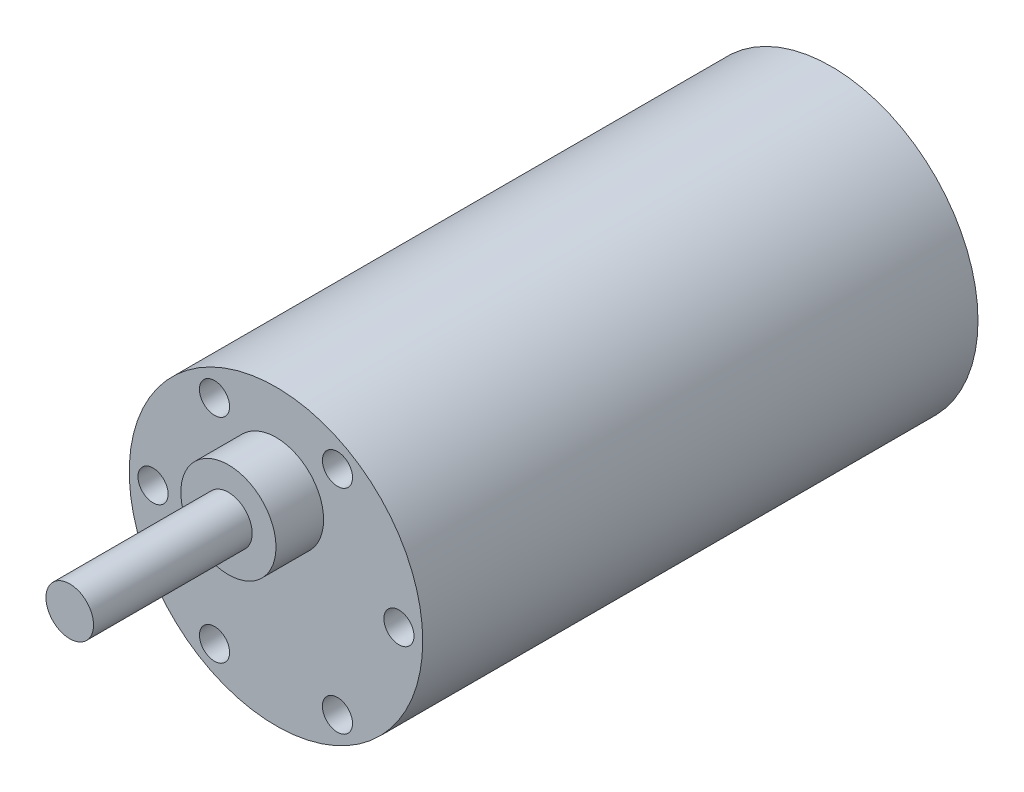
ISO-10303-21;
HEADER;
FILE_DESCRIPTION(('STEP AP214'),'2;1');
FILE_NAME('part.step','',(''),(''),'','','');
FILE_SCHEMA(('AUTOMOTIVE_DESIGN { 1 0 10303 214 1 1 1 1 }'));
ENDSEC;
DATA;
#1=APPLICATION_CONTEXT('core data for automotive mechanical design processes');
#2=APPLICATION_PROTOCOL_DEFINITION('international standard','automotive_design',2000,#1);
#3=PRODUCT_CONTEXT('',#1,'mechanical');
#4=PRODUCT('Part','Part','',(#3));
#5=PRODUCT_RELATED_PRODUCT_CATEGORY('part','',(#4));
#6=PRODUCT_DEFINITION_FORMATION('','',#4);
#7=PRODUCT_DEFINITION_CONTEXT('part definition',#1,'design');
#8=PRODUCT_DEFINITION('design','',#6,#7);
#9=PRODUCT_DEFINITION_SHAPE('','',#8);
#10=(LENGTH_UNIT() NAMED_UNIT(*) SI_UNIT(.MILLI.,.METRE.));
#11=(NAMED_UNIT(*) PLANE_ANGLE_UNIT() SI_UNIT($,.RADIAN.));
#12=(NAMED_UNIT(*) SI_UNIT($,.STERADIAN.) SOLID_ANGLE_UNIT());
#13=UNCERTAINTY_MEASURE_WITH_UNIT(LENGTH_MEASURE(1.E-05),#10,'distance_accuracy_value','');
#14=(GEOMETRIC_REPRESENTATION_CONTEXT(3) GLOBAL_UNCERTAINTY_ASSIGNED_CONTEXT((#13)) GLOBAL_UNIT_ASSIGNED_CONTEXT((#10,
#11,#12)) REPRESENTATION_CONTEXT('',''));
#15=CARTESIAN_POINT('',(0.,0.,0.));
#16=DIRECTION('',(0.,0.,1.));
#17=DIRECTION('',(1.,0.,0.));
#18=AXIS2_PLACEMENT_3D('',#15,#16,#17);
#19=CARTESIAN_POINT('',(0.,0.,70.));
#20=DIRECTION('',(0.,0.,-1.));
#21=DIRECTION('',(-1.,0.,0.));
#22=AXIS2_PLACEMENT_3D('',#19,#20,#21);
#23=CYLINDRICAL_SURFACE('',#22,18.5);
#24=CARTESIAN_POINT('',(0.,0.,70.));
#25=DIRECTION('',(0.,0.,1.));
#26=DIRECTION('',(1.,0.,0.));
#27=AXIS2_PLACEMENT_3D('',#24,#25,#26);
#28=CIRCLE('',#27,18.5);
#29=CARTESIAN_POINT('',(18.5,0.,70.));
#30=VERTEX_POINT('',#29);
#31=EDGE_CURVE('E48',#30,#30,#28,.T.);
#32=ORIENTED_EDGE('',*,*,#31,.F.);
#33=EDGE_LOOP('',(#32));
#34=FACE_BOUND('',#33,.T.);
#35=CARTESIAN_POINT('',(0.,0.,0.));
#36=DIRECTION('',(0.,0.,1.));
#37=DIRECTION('',(1.,0.,0.));
#38=AXIS2_PLACEMENT_3D('',#35,#36,#37);
#39=CIRCLE('',#38,18.5);
#40=CARTESIAN_POINT('',(18.5,0.,0.));
#41=VERTEX_POINT('',#40);
#42=EDGE_CURVE('E44',#41,#41,#39,.T.);
#43=ORIENTED_EDGE('',*,*,#42,.T.);
#44=EDGE_LOOP('',(#43));
#45=FACE_BOUND('',#44,.T.);
#46=ADVANCED_FACE('F41',(#34,#45),#23,.T.);
#47=CARTESIAN_POINT('',(0.,0.,70.));
#48=DIRECTION('',(0.,0.,1.));
#49=DIRECTION('',(1.,0.,0.));
#50=AXIS2_PLACEMENT_3D('',#47,#48,#49);
#51=PLANE('',#50);
#52=CARTESIAN_POINT('',(0.,7.,70.));
#53=DIRECTION('',(0.,0.,1.));
#54=DIRECTION('',(1.,0.,0.));
#55=AXIS2_PLACEMENT_3D('',#52,#53,#54);
#56=CIRCLE('',#55,5.99999999999997);
#57=CARTESIAN_POINT('',(5.99999999999997,7.,70.));
#58=VERTEX_POINT('',#57);
#59=EDGE_CURVE('E60',#58,#58,#56,.T.);
#60=ORIENTED_EDGE('',*,*,#59,.F.);
#61=EDGE_LOOP('',(#60));
#62=FACE_BOUND('',#61,.T.);
#63=CARTESIAN_POINT('',(15.5,0.,70.));
#64=DIRECTION('',(0.,0.,1.));
#65=DIRECTION('',(1.,0.,0.));
#66=AXIS2_PLACEMENT_3D('',#63,#64,#65);
#67=CIRCLE('',#66,1.9);
#68=CARTESIAN_POINT('',(17.4,0.,70.));
#69=VERTEX_POINT('',#68);
#70=EDGE_CURVE('E66',#69,#69,#67,.T.);
#71=ORIENTED_EDGE('',*,*,#70,.F.);
#72=EDGE_LOOP('',(#71));
#73=FACE_BOUND('',#72,.T.);
#74=CARTESIAN_POINT('',(7.75,13.4233937586588,70.));
#75=DIRECTION('',(0.,0.,1.));
#76=DIRECTION('',(1.,0.,0.));
#77=AXIS2_PLACEMENT_3D('',#74,#75,#76);
#78=CIRCLE('',#77,1.90000000000002);
#79=CARTESIAN_POINT('',(9.65000000000002,13.4233937586588,70.));
#80=VERTEX_POINT('',#79);
#81=EDGE_CURVE('E59',#80,#80,#78,.T.);
#82=ORIENTED_EDGE('',*,*,#81,.F.);
#83=EDGE_LOOP('',(#82));
#84=FACE_BOUND('',#83,.T.);
#85=CARTESIAN_POINT('',(-7.75000000000001,13.4233937586588,70.));
#86=DIRECTION('',(0.,0.,1.));
#87=DIRECTION('',(1.,0.,0.));
#88=AXIS2_PLACEMENT_3D('',#85,#86,#87);
#89=CIRCLE('',#88,1.9);
#90=CARTESIAN_POINT('',(-5.85,13.4233937586588,70.));
#91=VERTEX_POINT('',#90);
#92=EDGE_CURVE('E73',#91,#91,#89,.T.);
#93=ORIENTED_EDGE('',*,*,#92,.F.);
#94=EDGE_LOOP('',(#93));
#95=FACE_BOUND('',#94,.T.);
#96=CARTESIAN_POINT('',(-15.5,0.,70.));
#97=DIRECTION('',(0.,0.,1.));
#98=DIRECTION('',(1.,0.,0.));
#99=AXIS2_PLACEMENT_3D('',#96,#97,#98);
#100=CIRCLE('',#99,1.9);
#101=CARTESIAN_POINT('',(-13.6,0.,70.));
#102=VERTEX_POINT('',#101);
#103=EDGE_CURVE('E90',#102,#102,#100,.T.);
#104=ORIENTED_EDGE('',*,*,#103,.F.);
#105=EDGE_LOOP('',(#104));
#106=FACE_BOUND('',#105,.T.);
#107=CARTESIAN_POINT('',(-7.75,-13.4233937586588,70.));
#108=DIRECTION('',(0.,0.,1.));
#109=DIRECTION('',(1.,0.,0.));
#110=AXIS2_PLACEMENT_3D('',#107,#108,#109);
#111=CIRCLE('',#110,1.9);
#112=CARTESIAN_POINT('',(-5.85,-13.4233937586588,70.));
#113=VERTEX_POINT('',#112);
#114=EDGE_CURVE('E84',#113,#113,#111,.T.);
#115=ORIENTED_EDGE('',*,*,#114,.F.);
#116=EDGE_LOOP('',(#115));
#117=FACE_BOUND('',#116,.T.);
#118=CARTESIAN_POINT('',(7.75,-13.4233937586588,70.));
#119=DIRECTION('',(0.,0.,1.));
#120=DIRECTION('',(1.,0.,0.));
#121=AXIS2_PLACEMENT_3D('',#118,#119,#120);
#122=CIRCLE('',#121,1.9);
#123=CARTESIAN_POINT('',(9.65,-13.4233937586588,70.));
#124=VERTEX_POINT('',#123);
#125=EDGE_CURVE('E78',#124,#124,#122,.T.);
#126=ORIENTED_EDGE('',*,*,#125,.F.);
#127=EDGE_LOOP('',(#126));
#128=FACE_BOUND('',#127,.T.);
#129=ORIENTED_EDGE('',*,*,#31,.T.);
#130=EDGE_LOOP('',(#129));
#131=FACE_BOUND('',#130,.T.);
#132=ADVANCED_FACE('F101',(#62,#73,#84,#95,#106,#117,#128,#131),#51,.T.);
#133=CARTESIAN_POINT('',(0.,0.,0.));
#134=DIRECTION('',(0.,0.,1.));
#135=DIRECTION('',(1.,0.,0.));
#136=AXIS2_PLACEMENT_3D('',#133,#134,#135);
#137=PLANE('',#136);
#138=ORIENTED_EDGE('',*,*,#42,.F.);
#139=EDGE_LOOP('',(#138));
#140=FACE_BOUND('',#139,.T.);
#141=ADVANCED_FACE('F104',(#140),#137,.F.);
#142=CARTESIAN_POINT('',(7.75,-13.4233937586588,67.));
#143=DIRECTION('',(0.,0.,1.));
#144=DIRECTION('',(1.,0.,0.));
#145=AXIS2_PLACEMENT_3D('',#142,#143,#144);
#146=CYLINDRICAL_SURFACE('',#145,1.9);
#147=CARTESIAN_POINT('',(7.75,-13.4233937586588,67.));
#148=DIRECTION('',(0.,0.,1.));
#149=DIRECTION('',(1.,0.,0.));
#150=AXIS2_PLACEMENT_3D('',#147,#148,#149);
#151=CIRCLE('',#150,1.9);
#152=CARTESIAN_POINT('',(9.65,-13.4233937586588,67.));
#153=VERTEX_POINT('',#152);
#154=EDGE_CURVE('E69',#153,#153,#151,.T.);
#155=ORIENTED_EDGE('',*,*,#154,.F.);
#156=EDGE_LOOP('',(#155));
#157=FACE_BOUND('',#156,.T.);
#158=ORIENTED_EDGE('',*,*,#125,.T.);
#159=EDGE_LOOP('',(#158));
#160=FACE_BOUND('',#159,.T.);
#161=ADVANCED_FACE('F121',(#157,#160),#146,.F.);
#162=CARTESIAN_POINT('',(0.,0.,67.));
#163=DIRECTION('',(0.,0.,1.));
#164=DIRECTION('',(1.,0.,0.));
#165=AXIS2_PLACEMENT_3D('',#162,#163,#164);
#166=PLANE('',#165);
#167=ORIENTED_EDGE('',*,*,#154,.T.);
#168=EDGE_LOOP('',(#167));
#169=FACE_BOUND('',#168,.T.);
#170=ADVANCED_FACE('F125',(#169),#166,.T.);
#171=CARTESIAN_POINT('',(-7.75,-13.4233937586588,67.));
#172=DIRECTION('',(0.,0.,1.));
#173=DIRECTION('',(1.,0.,0.));
#174=AXIS2_PLACEMENT_3D('',#171,#172,#173);
#175=CYLINDRICAL_SURFACE('',#174,1.9);
#176=CARTESIAN_POINT('',(-7.75,-13.4233937586588,67.));
#177=DIRECTION('',(0.,0.,1.));
#178=DIRECTION('',(1.,0.,0.));
#179=AXIS2_PLACEMENT_3D('',#176,#177,#178);
#180=CIRCLE('',#179,1.9);
#181=CARTESIAN_POINT('',(-5.85,-13.4233937586588,67.));
#182=VERTEX_POINT('',#181);
#183=EDGE_CURVE('E81',#182,#182,#180,.T.);
#184=ORIENTED_EDGE('',*,*,#183,.F.);
#185=EDGE_LOOP('',(#184));
#186=FACE_BOUND('',#185,.T.);
#187=ORIENTED_EDGE('',*,*,#114,.T.);
#188=EDGE_LOOP('',(#187));
#189=FACE_BOUND('',#188,.T.);
#190=ADVANCED_FACE('F146',(#186,#189),#175,.F.);
#191=CARTESIAN_POINT('',(0.,0.,67.));
#192=DIRECTION('',(0.,0.,1.));
#193=DIRECTION('',(1.,0.,0.));
#194=AXIS2_PLACEMENT_3D('',#191,#192,#193);
#195=PLANE('',#194);
#196=ORIENTED_EDGE('',*,*,#183,.T.);
#197=EDGE_LOOP('',(#196));
#198=FACE_BOUND('',#197,.T.);
#199=ADVANCED_FACE('F141',(#198),#195,.T.);
#200=CARTESIAN_POINT('',(-15.5,0.,67.));
#201=DIRECTION('',(0.,0.,1.));
#202=DIRECTION('',(1.,0.,0.));
#203=AXIS2_PLACEMENT_3D('',#200,#201,#202);
#204=CYLINDRICAL_SURFACE('',#203,1.9);
#205=CARTESIAN_POINT('',(-15.5,0.,67.));
#206=DIRECTION('',(0.,0.,1.));
#207=DIRECTION('',(1.,0.,0.));
#208=AXIS2_PLACEMENT_3D('',#205,#206,#207);
#209=CIRCLE('',#208,1.9);
#210=CARTESIAN_POINT('',(-13.6,0.,67.));
#211=VERTEX_POINT('',#210);
#212=EDGE_CURVE('E87',#211,#211,#209,.T.);
#213=ORIENTED_EDGE('',*,*,#212,.F.);
#214=EDGE_LOOP('',(#213));
#215=FACE_BOUND('',#214,.T.);
#216=ORIENTED_EDGE('',*,*,#103,.T.);
#217=EDGE_LOOP('',(#216));
#218=FACE_BOUND('',#217,.T.);
#219=ADVANCED_FACE('F138',(#215,#218),#204,.F.);
#220=CARTESIAN_POINT('',(0.,0.,67.));
#221=DIRECTION('',(0.,0.,1.));
#222=DIRECTION('',(1.,0.,0.));
#223=AXIS2_PLACEMENT_3D('',#220,#221,#222);
#224=PLANE('',#223);
#225=ORIENTED_EDGE('',*,*,#212,.T.);
#226=EDGE_LOOP('',(#225));
#227=FACE_BOUND('',#226,.T.);
#228=ADVANCED_FACE('F132',(#227),#224,.T.);
#229=CARTESIAN_POINT('',(-7.75000000000001,13.4233937586588,67.));
#230=DIRECTION('',(0.,0.,1.));
#231=DIRECTION('',(1.,0.,0.));
#232=AXIS2_PLACEMENT_3D('',#229,#230,#231);
#233=CYLINDRICAL_SURFACE('',#232,1.9);
#234=CARTESIAN_POINT('',(-7.75000000000001,13.4233937586588,67.));
#235=DIRECTION('',(0.,0.,1.));
#236=DIRECTION('',(1.,0.,0.));
#237=AXIS2_PLACEMENT_3D('',#234,#235,#236);
#238=CIRCLE('',#237,1.9);
#239=CARTESIAN_POINT('',(-5.85,13.4233937586588,67.));
#240=VERTEX_POINT('',#239);
#241=EDGE_CURVE('E93',#240,#240,#238,.T.);
#242=ORIENTED_EDGE('',*,*,#241,.F.);
#243=EDGE_LOOP('',(#242));
#244=FACE_BOUND('',#243,.T.);
#245=ORIENTED_EDGE('',*,*,#92,.T.);
#246=EDGE_LOOP('',(#245));
#247=FACE_BOUND('',#246,.T.);
#248=ADVANCED_FACE('F99',(#244,#247),#233,.F.);
#249=CARTESIAN_POINT('',(0.,0.,67.));
#250=DIRECTION('',(0.,0.,1.));
#251=DIRECTION('',(1.,0.,0.));
#252=AXIS2_PLACEMENT_3D('',#249,#250,#251);
#253=PLANE('',#252);
#254=ORIENTED_EDGE('',*,*,#241,.T.);
#255=EDGE_LOOP('',(#254));
#256=FACE_BOUND('',#255,.T.);
#257=ADVANCED_FACE('F131',(#256),#253,.T.);
#258=CARTESIAN_POINT('',(7.75,13.4233937586588,67.));
#259=DIRECTION('',(0.,0.,1.));
#260=DIRECTION('',(1.,0.,0.));
#261=AXIS2_PLACEMENT_3D('',#258,#259,#260);
#262=CYLINDRICAL_SURFACE('',#261,1.90000000000002);
#263=CARTESIAN_POINT('',(7.75,13.4233937586588,67.));
#264=DIRECTION('',(0.,0.,1.));
#265=DIRECTION('',(1.,0.,0.));
#266=AXIS2_PLACEMENT_3D('',#263,#264,#265);
#267=CIRCLE('',#266,1.90000000000002);
#268=CARTESIAN_POINT('',(9.65000000000002,13.4233937586588,67.));
#269=VERTEX_POINT('',#268);
#270=EDGE_CURVE('E70',#269,#269,#267,.T.);
#271=ORIENTED_EDGE('',*,*,#270,.F.);
#272=EDGE_LOOP('',(#271));
#273=FACE_BOUND('',#272,.T.);
#274=ORIENTED_EDGE('',*,*,#81,.T.);
#275=EDGE_LOOP('',(#274));
#276=FACE_BOUND('',#275,.T.);
#277=ADVANCED_FACE('F136',(#273,#276),#262,.F.);
#278=CARTESIAN_POINT('',(0.,0.,67.));
#279=DIRECTION('',(0.,0.,1.));
#280=DIRECTION('',(1.,0.,0.));
#281=AXIS2_PLACEMENT_3D('',#278,#279,#280);
#282=PLANE('',#281);
#283=ORIENTED_EDGE('',*,*,#270,.T.);
#284=EDGE_LOOP('',(#283));
#285=FACE_BOUND('',#284,.T.);
#286=ADVANCED_FACE('F158',(#285),#282,.T.);
#287=CARTESIAN_POINT('',(15.5,0.,67.));
#288=DIRECTION('',(0.,0.,1.));
#289=DIRECTION('',(1.,0.,0.));
#290=AXIS2_PLACEMENT_3D('',#287,#288,#289);
#291=CYLINDRICAL_SURFACE('',#290,1.9);
#292=CARTESIAN_POINT('',(15.5,0.,67.));
#293=DIRECTION('',(0.,0.,1.));
#294=DIRECTION('',(1.,0.,0.));
#295=AXIS2_PLACEMENT_3D('',#292,#293,#294);
#296=CIRCLE('',#295,1.9);
#297=CARTESIAN_POINT('',(17.4,0.,67.));
#298=VERTEX_POINT('',#297);
#299=EDGE_CURVE('E63',#298,#298,#296,.T.);
#300=ORIENTED_EDGE('',*,*,#299,.F.);
#301=EDGE_LOOP('',(#300));
#302=FACE_BOUND('',#301,.T.);
#303=ORIENTED_EDGE('',*,*,#70,.T.);
#304=EDGE_LOOP('',(#303));
#305=FACE_BOUND('',#304,.T.);
#306=ADVANCED_FACE('F162',(#302,#305),#291,.F.);
#307=CARTESIAN_POINT('',(0.,0.,67.));
#308=DIRECTION('',(0.,0.,1.));
#309=DIRECTION('',(1.,0.,0.));
#310=AXIS2_PLACEMENT_3D('',#307,#308,#309);
#311=PLANE('',#310);
#312=ORIENTED_EDGE('',*,*,#299,.T.);
#313=EDGE_LOOP('',(#312));
#314=FACE_BOUND('',#313,.T.);
#315=ADVANCED_FACE('F166',(#314),#311,.T.);
#316=CARTESIAN_POINT('',(0.,7.,76.));
#317=DIRECTION('',(0.,0.,-1.));
#318=DIRECTION('',(-1.,0.,0.));
#319=AXIS2_PLACEMENT_3D('',#316,#317,#318);
#320=CYLINDRICAL_SURFACE('',#319,5.99999999999997);
#321=CARTESIAN_POINT('',(0.,7.,76.));
#322=DIRECTION('',(0.,0.,1.));
#323=DIRECTION('',(1.,0.,0.));
#324=AXIS2_PLACEMENT_3D('',#321,#322,#323);
#325=CIRCLE('',#324,5.99999999999997);
#326=CARTESIAN_POINT('',(5.99999999999997,7.,76.));
#327=VERTEX_POINT('',#326);
#328=EDGE_CURVE('E56',#327,#327,#325,.T.);
#329=ORIENTED_EDGE('',*,*,#328,.F.);
#330=EDGE_LOOP('',(#329));
#331=FACE_BOUND('',#330,.T.);
#332=ORIENTED_EDGE('',*,*,#59,.T.);
#333=EDGE_LOOP('',(#332));
#334=FACE_BOUND('',#333,.T.);
#335=ADVANCED_FACE('F170',(#331,#334),#320,.T.);
#336=CARTESIAN_POINT('',(0.,0.,76.));
#337=DIRECTION('',(0.,0.,1.));
#338=DIRECTION('',(1.,0.,0.));
#339=AXIS2_PLACEMENT_3D('',#336,#337,#338);
#340=PLANE('',#339);
#341=CARTESIAN_POINT('',(0.,7.,76.));
#342=DIRECTION('',(0.,0.,1.));
#343=DIRECTION('',(1.,0.,0.));
#344=AXIS2_PLACEMENT_3D('',#341,#342,#343);
#345=CIRCLE('',#344,3.);
#346=CARTESIAN_POINT('',(3.,7.,76.));
#347=VERTEX_POINT('',#346);
#348=EDGE_CURVE('E10',#347,#347,#345,.T.);
#349=ORIENTED_EDGE('',*,*,#348,.F.);
#350=EDGE_LOOP('',(#349));
#351=FACE_BOUND('',#350,.T.);
#352=ORIENTED_EDGE('',*,*,#328,.T.);
#353=EDGE_LOOP('',(#352));
#354=FACE_BOUND('',#353,.T.);
#355=ADVANCED_FACE('F174',(#351,#354),#340,.T.);
#356=CARTESIAN_POINT('',(0.,7.,96.));
#357=DIRECTION('',(0.,0.,-1.));
#358=DIRECTION('',(-1.,0.,0.));
#359=AXIS2_PLACEMENT_3D('',#356,#357,#358);
#360=CYLINDRICAL_SURFACE('',#359,3.);
#361=CARTESIAN_POINT('',(0.,7.,96.));
#362=DIRECTION('',(0.,0.,1.));
#363=DIRECTION('',(1.,0.,0.));
#364=AXIS2_PLACEMENT_3D('',#361,#362,#363);
#365=CIRCLE('',#364,3.);
#366=CARTESIAN_POINT('',(3.,7.,96.));
#367=VERTEX_POINT('',#366);
#368=EDGE_CURVE('E55',#367,#367,#365,.T.);
#369=ORIENTED_EDGE('',*,*,#368,.F.);
#370=EDGE_LOOP('',(#369));
#371=FACE_BOUND('',#370,.T.);
#372=ORIENTED_EDGE('',*,*,#348,.T.);
#373=EDGE_LOOP('',(#372));
#374=FACE_BOUND('',#373,.T.);
#375=ADVANCED_FACE('F178',(#371,#374),#360,.T.);
#376=CARTESIAN_POINT('',(0.,7.,96.));
#377=DIRECTION('',(0.,0.,1.));
#378=DIRECTION('',(1.,0.,0.));
#379=AXIS2_PLACEMENT_3D('',#376,#377,#378);
#380=PLANE('',#379);
#381=ORIENTED_EDGE('',*,*,#368,.T.);
#382=EDGE_LOOP('',(#381));
#383=FACE_BOUND('',#382,.T.);
#384=ADVANCED_FACE('F182',(#383),#380,.T.);
#385=CLOSED_SHELL('',(#46,#132,#141,#161,#170,#190,#199,#219,#228,#248,#257,#277,#286,#306,#315,
#335,#355,#375,#384));
#386=MANIFOLD_SOLID_BREP('B2',#385);
#387=ADVANCED_BREP_SHAPE_REPRESENTATION('',(#18,#386),#14);
#388=SHAPE_DEFINITION_REPRESENTATION(#9,#387);
ENDSEC;
END-ISO-10303-21;
